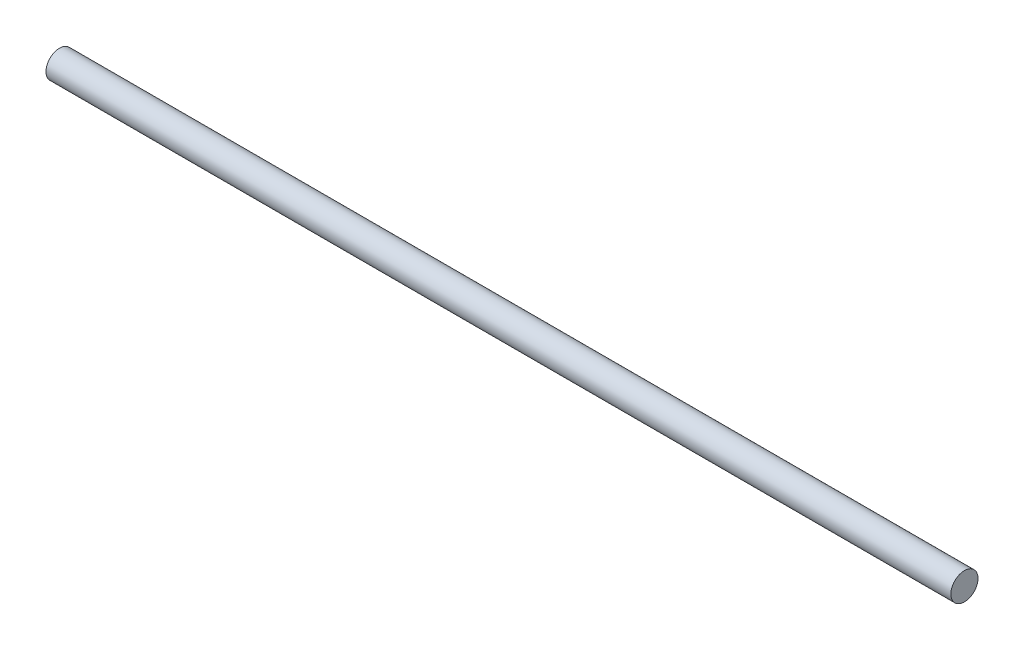
ISO-10303-21;
HEADER;
FILE_DESCRIPTION(('STEP AP214'),'2;1');
FILE_NAME('part.step','',(''),(''),'','','');
FILE_SCHEMA(('AUTOMOTIVE_DESIGN { 1 0 10303 214 1 1 1 1 }'));
ENDSEC;
DATA;
#1=APPLICATION_CONTEXT('core data for automotive mechanical design processes');
#2=APPLICATION_PROTOCOL_DEFINITION('international standard','automotive_design',2000,#1);
#3=PRODUCT_CONTEXT('',#1,'mechanical');
#4=PRODUCT('Part','Part','',(#3));
#5=PRODUCT_RELATED_PRODUCT_CATEGORY('part','',(#4));
#6=PRODUCT_DEFINITION_FORMATION('','',#4);
#7=PRODUCT_DEFINITION_CONTEXT('part definition',#1,'design');
#8=PRODUCT_DEFINITION('design','',#6,#7);
#9=PRODUCT_DEFINITION_SHAPE('','',#8);
#10=(LENGTH_UNIT() NAMED_UNIT(*) SI_UNIT(.MILLI.,.METRE.));
#11=(NAMED_UNIT(*) PLANE_ANGLE_UNIT() SI_UNIT($,.RADIAN.));
#12=(NAMED_UNIT(*) SI_UNIT($,.STERADIAN.) SOLID_ANGLE_UNIT());
#13=UNCERTAINTY_MEASURE_WITH_UNIT(LENGTH_MEASURE(1.E-05),#10,'distance_accuracy_value','');
#14=(GEOMETRIC_REPRESENTATION_CONTEXT(3) GLOBAL_UNCERTAINTY_ASSIGNED_CONTEXT((#13)) GLOBAL_UNIT_ASSIGNED_CONTEXT((#10,
#11,#12)) REPRESENTATION_CONTEXT('',''));
#15=CARTESIAN_POINT('',(0.,0.,0.));
#16=DIRECTION('',(0.,0.,1.));
#17=DIRECTION('',(1.,0.,0.));
#18=AXIS2_PLACEMENT_3D('',#15,#16,#17);
#19=CARTESIAN_POINT('',(1000.,0.,0.));
#20=DIRECTION('',(-1.,0.,0.));
#21=DIRECTION('',(0.,0.,1.));
#22=AXIS2_PLACEMENT_3D('',#19,#20,#21);
#23=CYLINDRICAL_SURFACE('',#22,15.);
#24=CARTESIAN_POINT('',(1000.,0.,0.));
#25=DIRECTION('',(1.,0.,0.));
#26=DIRECTION('',(0.,0.,-1.));
#27=AXIS2_PLACEMENT_3D('',#24,#25,#26);
#28=CIRCLE('',#27,15.);
#29=CARTESIAN_POINT('',(1000.,0.,-15.));
#30=VERTEX_POINT('',#29);
#31=EDGE_CURVE('E10',#30,#30,#28,.T.);
#32=ORIENTED_EDGE('',*,*,#31,.F.);
#33=EDGE_LOOP('',(#32));
#34=FACE_BOUND('',#33,.T.);
#35=CARTESIAN_POINT('',(0.,0.,0.));
#36=DIRECTION('',(1.,0.,0.));
#37=DIRECTION('',(0.,0.,-1.));
#38=AXIS2_PLACEMENT_3D('',#35,#36,#37);
#39=CIRCLE('',#38,15.);
#40=CARTESIAN_POINT('',(0.,0.,-15.));
#41=VERTEX_POINT('',#40);
#42=EDGE_CURVE('E34',#41,#41,#39,.T.);
#43=ORIENTED_EDGE('',*,*,#42,.T.);
#44=EDGE_LOOP('',(#43));
#45=FACE_BOUND('',#44,.T.);
#46=ADVANCED_FACE('F31',(#34,#45),#23,.T.);
#47=CARTESIAN_POINT('',(1000.,0.,0.));
#48=DIRECTION('',(1.,0.,0.));
#49=DIRECTION('',(0.,0.,-1.));
#50=AXIS2_PLACEMENT_3D('',#47,#48,#49);
#51=PLANE('',#50);
#52=ORIENTED_EDGE('',*,*,#31,.T.);
#53=EDGE_LOOP('',(#52));
#54=FACE_BOUND('',#53,.T.);
#55=ADVANCED_FACE('F46',(#54),#51,.T.);
#56=CARTESIAN_POINT('',(0.,0.,0.));
#57=DIRECTION('',(1.,0.,0.));
#58=DIRECTION('',(0.,0.,-1.));
#59=AXIS2_PLACEMENT_3D('',#56,#57,#58);
#60=PLANE('',#59);
#61=ORIENTED_EDGE('',*,*,#42,.F.);
#62=EDGE_LOOP('',(#61));
#63=FACE_BOUND('',#62,.T.);
#64=ADVANCED_FACE('F44',(#63),#60,.F.);
#65=CLOSED_SHELL('',(#46,#55,#64));
#66=MANIFOLD_SOLID_BREP('B2',#65);
#67=ADVANCED_BREP_SHAPE_REPRESENTATION('',(#18,#66),#14);
#68=SHAPE_DEFINITION_REPRESENTATION(#9,#67);
ENDSEC;
END-ISO-10303-21;
